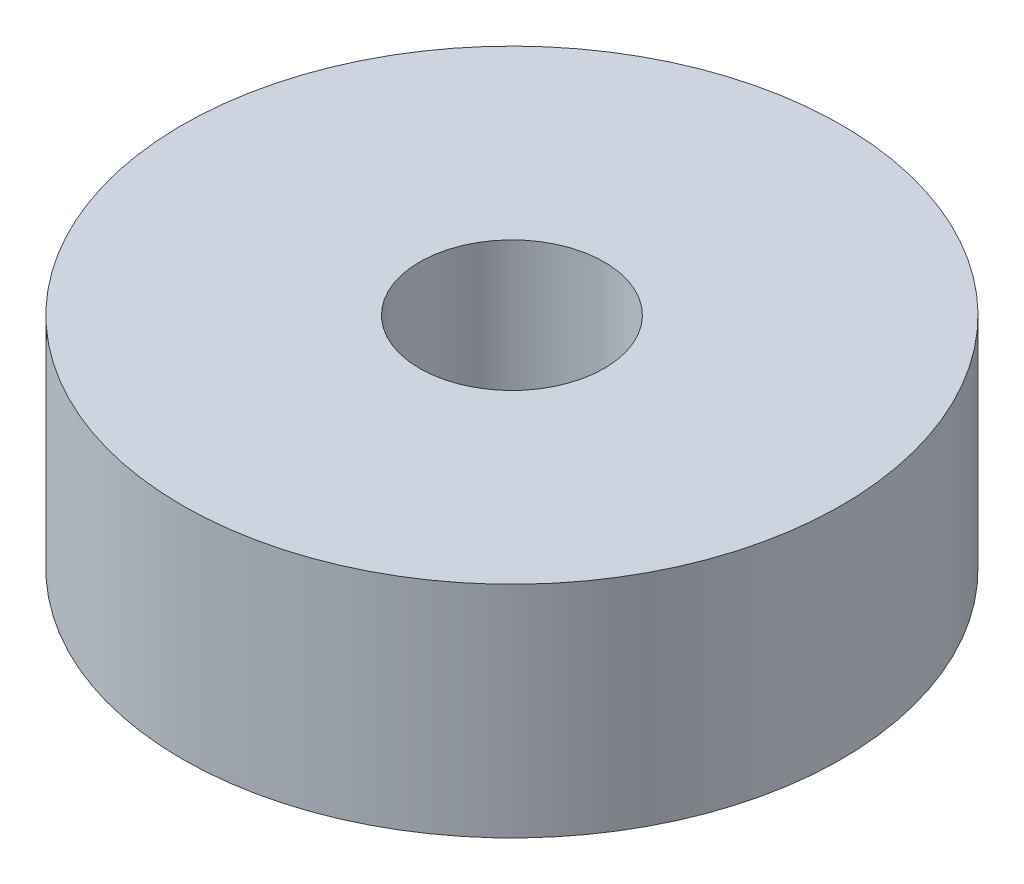
ISO-10303-21;
HEADER;
FILE_DESCRIPTION(('STEP AP214'),'2;1');
FILE_NAME('part.step','',(''),(''),'','','');
FILE_SCHEMA(('AUTOMOTIVE_DESIGN { 1 0 10303 214 1 1 1 1 }'));
ENDSEC;
DATA;
#1=APPLICATION_CONTEXT('core data for automotive mechanical design processes');
#2=APPLICATION_PROTOCOL_DEFINITION('international standard','automotive_design',2000,#1);
#3=PRODUCT_CONTEXT('',#1,'mechanical');
#4=PRODUCT('Part','Part','',(#3));
#5=PRODUCT_RELATED_PRODUCT_CATEGORY('part','',(#4));
#6=PRODUCT_DEFINITION_FORMATION('','',#4);
#7=PRODUCT_DEFINITION_CONTEXT('part definition',#1,'design');
#8=PRODUCT_DEFINITION('design','',#6,#7);
#9=PRODUCT_DEFINITION_SHAPE('','',#8);
#10=(LENGTH_UNIT() NAMED_UNIT(*) SI_UNIT(.MILLI.,.METRE.));
#11=(NAMED_UNIT(*) PLANE_ANGLE_UNIT() SI_UNIT($,.RADIAN.));
#12=(NAMED_UNIT(*) SI_UNIT($,.STERADIAN.) SOLID_ANGLE_UNIT());
#13=UNCERTAINTY_MEASURE_WITH_UNIT(LENGTH_MEASURE(1.E-05),#10,'distance_accuracy_value','');
#14=(GEOMETRIC_REPRESENTATION_CONTEXT(3) GLOBAL_UNCERTAINTY_ASSIGNED_CONTEXT((#13)) GLOBAL_UNIT_ASSIGNED_CONTEXT((#10,
#11,#12)) REPRESENTATION_CONTEXT('',''));
#15=CARTESIAN_POINT('',(0.,0.,0.));
#16=DIRECTION('',(0.,0.,1.));
#17=DIRECTION('',(1.,0.,0.));
#18=AXIS2_PLACEMENT_3D('',#15,#16,#17);
#19=CARTESIAN_POINT('',(0.,5.,0.));
#20=DIRECTION('',(0.,1.,0.));
#21=DIRECTION('',(0.,0.,1.));
#22=AXIS2_PLACEMENT_3D('',#19,#20,#21);
#23=PLANE('',#22);
#24=CARTESIAN_POINT('',(0.,5.,0.));
#25=DIRECTION('',(0.,1.,0.));
#26=DIRECTION('',(0.,0.,1.));
#27=AXIS2_PLACEMENT_3D('',#24,#25,#26);
#28=CIRCLE('',#27,7.5);
#29=CARTESIAN_POINT('',(0.,5.,7.5));
#30=VERTEX_POINT('',#29);
#31=EDGE_CURVE('E10',#30,#30,#28,.T.);
#32=ORIENTED_EDGE('',*,*,#31,.T.);
#33=EDGE_LOOP('',(#32));
#34=FACE_BOUND('',#33,.T.);
#35=CARTESIAN_POINT('',(0.,5.,0.));
#36=DIRECTION('',(0.,1.,0.));
#37=DIRECTION('',(0.,0.,1.));
#38=AXIS2_PLACEMENT_3D('',#35,#36,#37);
#39=CIRCLE('',#38,2.1);
#40=CARTESIAN_POINT('',(0.,5.,2.1));
#41=VERTEX_POINT('',#40);
#42=EDGE_CURVE('E44',#41,#41,#39,.T.);
#43=ORIENTED_EDGE('',*,*,#42,.F.);
#44=EDGE_LOOP('',(#43));
#45=FACE_BOUND('',#44,.T.);
#46=ADVANCED_FACE('F33',(#34,#45),#23,.T.);
#47=CARTESIAN_POINT('',(0.,0.,0.));
#48=DIRECTION('',(0.,1.,0.));
#49=DIRECTION('',(0.,0.,1.));
#50=AXIS2_PLACEMENT_3D('',#47,#48,#49);
#51=PLANE('',#50);
#52=CARTESIAN_POINT('',(0.,0.,0.));
#53=DIRECTION('',(0.,1.,0.));
#54=DIRECTION('',(0.,0.,1.));
#55=AXIS2_PLACEMENT_3D('',#52,#53,#54);
#56=CIRCLE('',#55,7.5);
#57=CARTESIAN_POINT('',(0.,0.,7.5));
#58=VERTEX_POINT('',#57);
#59=EDGE_CURVE('E37',#58,#58,#56,.T.);
#60=ORIENTED_EDGE('',*,*,#59,.F.);
#61=EDGE_LOOP('',(#60));
#62=FACE_BOUND('',#61,.T.);
#63=CARTESIAN_POINT('',(0.,0.,0.));
#64=DIRECTION('',(0.,1.,0.));
#65=DIRECTION('',(0.,0.,1.));
#66=AXIS2_PLACEMENT_3D('',#63,#64,#65);
#67=CIRCLE('',#66,2.1);
#68=CARTESIAN_POINT('',(0.,0.,2.1));
#69=VERTEX_POINT('',#68);
#70=EDGE_CURVE('E46',#69,#69,#67,.T.);
#71=ORIENTED_EDGE('',*,*,#70,.T.);
#72=EDGE_LOOP('',(#71));
#73=FACE_BOUND('',#72,.T.);
#74=ADVANCED_FACE('F56',(#62,#73),#51,.F.);
#75=CARTESIAN_POINT('',(0.,5.,0.));
#76=DIRECTION('',(0.,-1.,0.));
#77=DIRECTION('',(0.,0.,-1.));
#78=AXIS2_PLACEMENT_3D('',#75,#76,#77);
#79=CYLINDRICAL_SURFACE('',#78,7.5);
#80=ORIENTED_EDGE('',*,*,#31,.F.);
#81=EDGE_LOOP('',(#80));
#82=FACE_BOUND('',#81,.T.);
#83=ORIENTED_EDGE('',*,*,#59,.T.);
#84=EDGE_LOOP('',(#83));
#85=FACE_BOUND('',#84,.T.);
#86=ADVANCED_FACE('F35',(#82,#85),#79,.T.);
#87=CARTESIAN_POINT('',(0.,5.,0.));
#88=DIRECTION('',(0.,-1.,0.));
#89=DIRECTION('',(0.,0.,-1.));
#90=AXIS2_PLACEMENT_3D('',#87,#88,#89);
#91=CYLINDRICAL_SURFACE('',#90,2.1);
#92=ORIENTED_EDGE('',*,*,#42,.T.);
#93=EDGE_LOOP('',(#92));
#94=FACE_BOUND('',#93,.T.);
#95=ORIENTED_EDGE('',*,*,#70,.F.);
#96=EDGE_LOOP('',(#95));
#97=FACE_BOUND('',#96,.T.);
#98=ADVANCED_FACE('F52',(#94,#97),#91,.F.);
#99=CLOSED_SHELL('',(#46,#74,#86,#98));
#100=MANIFOLD_SOLID_BREP('B2',#99);
#101=ADVANCED_BREP_SHAPE_REPRESENTATION('',(#18,#100),#14);
#102=SHAPE_DEFINITION_REPRESENTATION(#9,#101);
ENDSEC;
END-ISO-10303-21;
